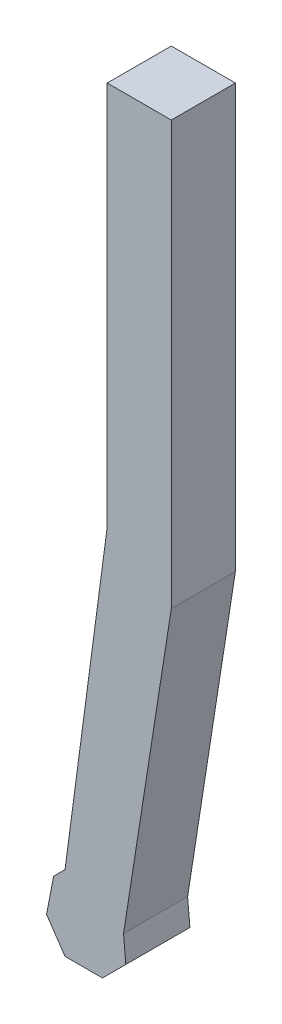
ISO-10303-21;
HEADER;
FILE_DESCRIPTION(('STEP AP214'),'2;1');
FILE_NAME('part.step','',(''),(''),'','','');
FILE_SCHEMA(('AUTOMOTIVE_DESIGN { 1 0 10303 214 1 1 1 1 }'));
ENDSEC;
DATA;
#1=APPLICATION_CONTEXT('core data for automotive mechanical design processes');
#2=APPLICATION_PROTOCOL_DEFINITION('international standard','automotive_design',2000,#1);
#3=PRODUCT_CONTEXT('',#1,'mechanical');
#4=PRODUCT('Part','Part','',(#3));
#5=PRODUCT_RELATED_PRODUCT_CATEGORY('part','',(#4));
#6=PRODUCT_DEFINITION_FORMATION('','',#4);
#7=PRODUCT_DEFINITION_CONTEXT('part definition',#1,'design');
#8=PRODUCT_DEFINITION('design','',#6,#7);
#9=PRODUCT_DEFINITION_SHAPE('','',#8);
#10=(LENGTH_UNIT() NAMED_UNIT(*) SI_UNIT(.MILLI.,.METRE.));
#11=(NAMED_UNIT(*) PLANE_ANGLE_UNIT() SI_UNIT($,.RADIAN.));
#12=(NAMED_UNIT(*) SI_UNIT($,.STERADIAN.) SOLID_ANGLE_UNIT());
#13=UNCERTAINTY_MEASURE_WITH_UNIT(LENGTH_MEASURE(1.E-05),#10,'distance_accuracy_value','');
#14=(GEOMETRIC_REPRESENTATION_CONTEXT(3) GLOBAL_UNCERTAINTY_ASSIGNED_CONTEXT((#13)) GLOBAL_UNIT_ASSIGNED_CONTEXT((#10,
#11,#12)) REPRESENTATION_CONTEXT('',''));
#15=CARTESIAN_POINT('',(0.,0.,0.));
#16=DIRECTION('',(0.,0.,1.));
#17=DIRECTION('',(1.,0.,0.));
#18=AXIS2_PLACEMENT_3D('',#15,#16,#17);
#19=CARTESIAN_POINT('',(10.9658885094651,-10.9658885094649,5.));
#20=DIRECTION('',(-0.707106781186554,0.707106781186541,0.));
#21=DIRECTION('',(-0.707106781186541,-0.707106781186554,0.));
#22=AXIS2_PLACEMENT_3D('',#19,#20,#21);
#23=PLANE('',#22);
#24=DIRECTION('',(0.707106781186541,0.707106781186554,0.));
#25=VECTOR('',#24,1.);
#26=CARTESIAN_POINT('',(10.9658885094651,-10.9658885094649,0.));
#27=LINE('',#26,#25);
#28=CARTESIAN_POINT('',(0.712067707518721,-21.2197093114115,0.));
#29=VERTEX_POINT('',#28);
#30=CARTESIAN_POINT('',(2.53558057867476,-19.3961964402554,0.));
#31=VERTEX_POINT('',#30);
#32=EDGE_CURVE('E155',#29,#31,#27,.T.);
#33=ORIENTED_EDGE('',*,*,#32,.T.);
#34=DIRECTION('',(0.,0.,-1.));
#35=VECTOR('',#34,1.);
#36=CARTESIAN_POINT('',(2.53558057867476,-19.3961964402554,5.));
#37=LINE('',#36,#35);
#38=CARTESIAN_POINT('',(2.53558057867476,-19.3961964402554,5.));
#39=VERTEX_POINT('',#38);
#40=EDGE_CURVE('E11',#39,#31,#37,.T.);
#41=ORIENTED_EDGE('',*,*,#40,.F.);
#42=DIRECTION('',(0.707106781186541,0.707106781186554,0.));
#43=VECTOR('',#42,1.);
#44=CARTESIAN_POINT('',(10.9658885094651,-10.9658885094649,5.));
#45=LINE('',#44,#43);
#46=CARTESIAN_POINT('',(0.712067707518721,-21.2197093114115,5.));
#47=VERTEX_POINT('',#46);
#48=EDGE_CURVE('E179',#47,#39,#45,.T.);
#49=ORIENTED_EDGE('',*,*,#48,.F.);
#50=DIRECTION('',(0.,0.,-1.));
#51=VECTOR('',#50,1.);
#52=CARTESIAN_POINT('',(0.712067707518721,-21.2197093114115,5.));
#53=LINE('',#52,#51);
#54=EDGE_CURVE('E151',#47,#29,#53,.T.);
#55=ORIENTED_EDGE('',*,*,#54,.T.);
#56=EDGE_LOOP('',(#33,#41,#49,#55));
#57=FACE_BOUND('',#56,.T.);
#58=ADVANCED_FACE('F41',(#57),#23,.F.);
#59=CARTESIAN_POINT('',(0.800509947770934,0.0713465126791633,5.));
#60=DIRECTION('',(-0.996051755430846,-0.088774436090187,0.));
#61=DIRECTION('',(0.088774436090187,-0.996051755430846,0.));
#62=AXIS2_PLACEMENT_3D('',#59,#60,#61);
#63=PLANE('',#62);
#64=DIRECTION('',(-0.088774436090187,0.996051755430846,0.));
#65=VECTOR('',#64,1.);
#66=CARTESIAN_POINT('',(0.800509947770934,0.0713465126791633,0.));
#67=LINE('',#66,#65);
#68=CARTESIAN_POINT('',(2.35780038750416,-17.4014975235942,0.));
#69=VERTEX_POINT('',#68);
#70=EDGE_CURVE('E158',#31,#69,#67,.T.);
#71=ORIENTED_EDGE('',*,*,#70,.T.);
#72=DIRECTION('',(0.,0.,-1.));
#73=VECTOR('',#72,1.);
#74=CARTESIAN_POINT('',(2.35780038750416,-17.4014975235942,5.));
#75=LINE('',#74,#73);
#76=CARTESIAN_POINT('',(2.35780038750416,-17.4014975235942,5.));
#77=VERTEX_POINT('',#76);
#78=EDGE_CURVE('E49',#77,#69,#75,.T.);
#79=ORIENTED_EDGE('',*,*,#78,.F.);
#80=DIRECTION('',(-0.088774436090187,0.996051755430846,0.));
#81=VECTOR('',#80,1.);
#82=CARTESIAN_POINT('',(0.800509947770934,0.0713465126791633,5.));
#83=LINE('',#82,#81);
#84=EDGE_CURVE('E109',#39,#77,#83,.T.);
#85=ORIENTED_EDGE('',*,*,#84,.F.);
#86=ORIENTED_EDGE('',*,*,#40,.T.);
#87=EDGE_LOOP('',(#71,#79,#85,#86));
#88=FACE_BOUND('',#87,.T.);
#89=ADVANCED_FACE('F200',(#88),#63,.F.);
#90=CARTESIAN_POINT('',(4.95814080161372,-0.775461693770349,5.));
#91=DIRECTION('',(0.987989161275998,-0.154523193084891,0.));
#92=DIRECTION('',(0.154523193084891,0.987989161275998,0.));
#93=AXIS2_PLACEMENT_3D('',#90,#91,#92);
#94=PLANE('',#93);
#95=DIRECTION('',(-0.154523193084891,-0.987989161275998,0.));
#96=VECTOR('',#95,1.);
#97=CARTESIAN_POINT('',(4.95814080161372,-0.775461693770349,0.));
#98=LINE('',#97,#96);
#99=CARTESIAN_POINT('',(6.08450000651986,6.42624481988781,0.));
#100=VERTEX_POINT('',#99);
#101=EDGE_CURVE('E161',#100,#69,#98,.T.);
#102=ORIENTED_EDGE('',*,*,#101,.F.);
#103=DIRECTION('',(0.,0.,-1.));
#104=VECTOR('',#103,1.);
#105=CARTESIAN_POINT('',(6.08450000651986,6.42624481988781,5.));
#106=LINE('',#105,#104);
#107=CARTESIAN_POINT('',(6.08450000651986,6.42624481988781,5.));
#108=VERTEX_POINT('',#107);
#109=EDGE_CURVE('E193',#108,#100,#106,.T.);
#110=ORIENTED_EDGE('',*,*,#109,.F.);
#111=DIRECTION('',(-0.154523193084891,-0.987989161275998,0.));
#112=VECTOR('',#111,1.);
#113=CARTESIAN_POINT('',(4.95814080161372,-0.775461693770349,5.));
#114=LINE('',#113,#112);
#115=EDGE_CURVE('E199',#108,#77,#114,.T.);
#116=ORIENTED_EDGE('',*,*,#115,.T.);
#117=ORIENTED_EDGE('',*,*,#78,.T.);
#118=EDGE_LOOP('',(#102,#110,#116,#117));
#119=FACE_BOUND('',#118,.T.);
#120=ADVANCED_FACE('F197',(#119),#94,.T.);
#121=CARTESIAN_POINT('',(6.08450000651986,0.,5.));
#122=DIRECTION('',(1.,0.,0.));
#123=DIRECTION('',(0.,1.,0.));
#124=AXIS2_PLACEMENT_3D('',#121,#122,#123);
#125=PLANE('',#124);
#126=DIRECTION('',(0.,-1.,0.));
#127=VECTOR('',#126,1.);
#128=CARTESIAN_POINT('',(6.08450000651986,0.,0.));
#129=LINE('',#128,#127);
#130=CARTESIAN_POINT('',(6.08450000651986,39.4262448198878,0.));
#131=VERTEX_POINT('',#130);
#132=EDGE_CURVE('E164',#131,#100,#129,.T.);
#133=ORIENTED_EDGE('',*,*,#132,.F.);
#134=DIRECTION('',(0.,0.,-1.));
#135=VECTOR('',#134,1.);
#136=CARTESIAN_POINT('',(6.08450000651986,39.4262448198878,5.));
#137=LINE('',#136,#135);
#138=CARTESIAN_POINT('',(6.08450000651986,39.4262448198878,5.));
#139=VERTEX_POINT('',#138);
#140=EDGE_CURVE('E191',#139,#131,#137,.T.);
#141=ORIENTED_EDGE('',*,*,#140,.F.);
#142=DIRECTION('',(0.,-1.,0.));
#143=VECTOR('',#142,1.);
#144=CARTESIAN_POINT('',(6.08450000651986,0.,5.));
#145=LINE('',#144,#143);
#146=EDGE_CURVE('E212',#139,#108,#145,.T.);
#147=ORIENTED_EDGE('',*,*,#146,.T.);
#148=ORIENTED_EDGE('',*,*,#109,.T.);
#149=EDGE_LOOP('',(#133,#141,#147,#148));
#150=FACE_BOUND('',#149,.T.);
#151=ADVANCED_FACE('F209',(#150),#125,.T.);
#152=CARTESIAN_POINT('',(0.,39.4262448198878,5.));
#153=DIRECTION('',(0.,1.,0.));
#154=DIRECTION('',(0.,0.,1.));
#155=AXIS2_PLACEMENT_3D('',#152,#153,#154);
#156=PLANE('',#155);
#157=DIRECTION('',(1.,0.,0.));
#158=VECTOR('',#157,1.);
#159=CARTESIAN_POINT('',(0.,39.4262448198878,0.));
#160=LINE('',#159,#158);
#161=CARTESIAN_POINT('',(1.08450000651986,39.4262448198878,0.));
#162=VERTEX_POINT('',#161);
#163=EDGE_CURVE('E167',#162,#131,#160,.T.);
#164=ORIENTED_EDGE('',*,*,#163,.F.);
#165=DIRECTION('',(0.,0.,-1.));
#166=VECTOR('',#165,1.);
#167=CARTESIAN_POINT('',(1.08450000651986,39.4262448198878,5.));
#168=LINE('',#167,#166);
#169=CARTESIAN_POINT('',(1.08450000651986,39.4262448198878,5.));
#170=VERTEX_POINT('',#169);
#171=EDGE_CURVE('E189',#170,#162,#168,.T.);
#172=ORIENTED_EDGE('',*,*,#171,.F.);
#173=DIRECTION('',(1.,0.,0.));
#174=VECTOR('',#173,1.);
#175=CARTESIAN_POINT('',(0.,39.4262448198878,5.));
#176=LINE('',#175,#174);
#177=EDGE_CURVE('E216',#170,#139,#176,.T.);
#178=ORIENTED_EDGE('',*,*,#177,.T.);
#179=ORIENTED_EDGE('',*,*,#140,.T.);
#180=EDGE_LOOP('',(#164,#172,#178,#179));
#181=FACE_BOUND('',#180,.T.);
#182=ADVANCED_FACE('F258',(#181),#156,.T.);
#183=CARTESIAN_POINT('',(1.08450000651986,0.,5.));
#184=DIRECTION('',(1.,0.,0.));
#185=DIRECTION('',(0.,1.,0.));
#186=AXIS2_PLACEMENT_3D('',#183,#184,#185);
#187=PLANE('',#186);
#188=DIRECTION('',(0.,-1.,0.));
#189=VECTOR('',#188,1.);
#190=CARTESIAN_POINT('',(1.08450000651986,0.,0.));
#191=LINE('',#190,#189);
#192=CARTESIAN_POINT('',(1.08450000651986,9.42624481988781,0.));
#193=VERTEX_POINT('',#192);
#194=EDGE_CURVE('E170',#162,#193,#191,.T.);
#195=ORIENTED_EDGE('',*,*,#194,.T.);
#196=DIRECTION('',(0.,0.,-1.));
#197=VECTOR('',#196,1.);
#198=CARTESIAN_POINT('',(1.08450000651986,9.42624481988781,5.));
#199=LINE('',#198,#197);
#200=CARTESIAN_POINT('',(1.08450000651986,9.42624481988781,5.));
#201=VERTEX_POINT('',#200);
#202=EDGE_CURVE('E186',#201,#193,#199,.T.);
#203=ORIENTED_EDGE('',*,*,#202,.F.);
#204=DIRECTION('',(0.,-1.,0.));
#205=VECTOR('',#204,1.);
#206=CARTESIAN_POINT('',(1.08450000651986,0.,5.));
#207=LINE('',#206,#205);
#208=EDGE_CURVE('E222',#170,#201,#207,.T.);
#209=ORIENTED_EDGE('',*,*,#208,.F.);
#210=ORIENTED_EDGE('',*,*,#171,.T.);
#211=EDGE_LOOP('',(#195,#203,#209,#210));
#212=FACE_BOUND('',#211,.T.);
#213=ADVANCED_FACE('F261',(#212),#187,.F.);
#214=CARTESIAN_POINT('',(-0.163735312612638,0.0217321414922228,5.));
#215=DIRECTION('',(0.991306431261412,-0.131573399058332,0.));
#216=DIRECTION('',(0.131573399058332,0.991306431261412,0.));
#217=AXIS2_PLACEMENT_3D('',#214,#215,#216);
#218=PLANE('',#217);
#219=DIRECTION('',(-0.131573399058332,-0.991306431261412,0.));
#220=VECTOR('',#219,1.);
#221=CARTESIAN_POINT('',(-0.163735312612638,0.0217321414922228,0.));
#222=LINE('',#221,#220);
#223=CARTESIAN_POINT('',(-2.20483496993844,-15.3564159616475,0.));
#224=VERTEX_POINT('',#223);
#225=EDGE_CURVE('E172',#193,#224,#222,.T.);
#226=ORIENTED_EDGE('',*,*,#225,.T.);
#227=DIRECTION('',(0.,0.,-1.));
#228=VECTOR('',#227,1.);
#229=CARTESIAN_POINT('',(-2.20483496993844,-15.3564159616475,5.));
#230=LINE('',#229,#228);
#231=CARTESIAN_POINT('',(-2.20483496993844,-15.3564159616475,5.));
#232=VERTEX_POINT('',#231);
#233=EDGE_CURVE('E183',#232,#224,#230,.T.);
#234=ORIENTED_EDGE('',*,*,#233,.F.);
#235=DIRECTION('',(-0.131573399058332,-0.991306431261412,0.));
#236=VECTOR('',#235,1.);
#237=CARTESIAN_POINT('',(-0.163735312612638,0.0217321414922228,5.));
#238=LINE('',#237,#236);
#239=EDGE_CURVE('E224',#201,#232,#238,.T.);
#240=ORIENTED_EDGE('',*,*,#239,.F.);
#241=ORIENTED_EDGE('',*,*,#202,.T.);
#242=EDGE_LOOP('',(#226,#234,#240,#241));
#243=FACE_BOUND('',#242,.T.);
#244=ADVANCED_FACE('F230',(#243),#218,.F.);
#245=CARTESIAN_POINT('',(6.5757904958545,-6.57579049585438,5.));
#246=DIRECTION('',(0.707106781186554,-0.707106781186541,0.));
#247=DIRECTION('',(0.707106781186541,0.707106781186554,0.));
#248=AXIS2_PLACEMENT_3D('',#245,#246,#247);
#249=PLANE('',#248);
#250=DIRECTION('',(-0.707106781186541,-0.707106781186554,0.));
#251=VECTOR('',#250,1.);
#252=CARTESIAN_POINT('',(6.5757904958545,-6.57579049585438,0.));
#253=LINE('',#252,#251);
#254=CARTESIAN_POINT('',(-3.09647287598627,-16.2480538676953,0.));
#255=VERTEX_POINT('',#254);
#256=EDGE_CURVE('E174',#224,#255,#253,.T.);
#257=ORIENTED_EDGE('',*,*,#256,.T.);
#258=DIRECTION('',(0.,0.,-1.));
#259=VECTOR('',#258,1.);
#260=CARTESIAN_POINT('',(-3.09647287598627,-16.2480538676953,5.));
#261=LINE('',#260,#259);
#262=CARTESIAN_POINT('',(-3.09647287598627,-16.2480538676953,5.));
#263=VERTEX_POINT('',#262);
#264=EDGE_CURVE('E146',#263,#255,#261,.T.);
#265=ORIENTED_EDGE('',*,*,#264,.F.);
#266=DIRECTION('',(-0.707106781186541,-0.707106781186554,0.));
#267=VECTOR('',#266,1.);
#268=CARTESIAN_POINT('',(6.5757904958545,-6.57579049585438,5.));
#269=LINE('',#268,#267);
#270=EDGE_CURVE('E137',#232,#263,#269,.T.);
#271=ORIENTED_EDGE('',*,*,#270,.F.);
#272=ORIENTED_EDGE('',*,*,#233,.T.);
#273=EDGE_LOOP('',(#257,#265,#271,#272));
#274=FACE_BOUND('',#273,.T.);
#275=ADVANCED_FACE('F234',(#274),#249,.F.);
#276=CARTESIAN_POINT('',(0.00993952606121932,-0.00190052785919091,5.));
#277=DIRECTION('',(0.982206003201185,-0.187806728515123,0.));
#278=DIRECTION('',(0.187806728515123,0.982206003201185,0.));
#279=AXIS2_PLACEMENT_3D('',#276,#277,#278);
#280=PLANE('',#279);
#281=DIRECTION('',(-0.187806728515123,-0.982206003201185,0.));
#282=VECTOR('',#281,1.);
#283=CARTESIAN_POINT('',(0.00993952606121932,-0.00190052785919091,0.));
#284=LINE('',#283,#282);
#285=CARTESIAN_POINT('',(-3.64228651433827,-19.1025918092113,0.));
#286=VERTEX_POINT('',#285);
#287=EDGE_CURVE('E145',#255,#286,#284,.T.);
#288=ORIENTED_EDGE('',*,*,#287,.T.);
#289=DIRECTION('',(0.,0.,-1.));
#290=VECTOR('',#289,1.);
#291=CARTESIAN_POINT('',(-3.64228651433827,-19.1025918092113,5.));
#292=LINE('',#291,#290);
#293=CARTESIAN_POINT('',(-3.64228651433827,-19.1025918092113,5.));
#294=VERTEX_POINT('',#293);
#295=EDGE_CURVE('E142',#294,#286,#292,.T.);
#296=ORIENTED_EDGE('',*,*,#295,.F.);
#297=DIRECTION('',(-0.187806728515123,-0.982206003201185,0.));
#298=VECTOR('',#297,1.);
#299=CARTESIAN_POINT('',(0.00993952606121932,-0.00190052785919091,5.));
#300=LINE('',#299,#298);
#301=EDGE_CURVE('E131',#263,#294,#300,.T.);
#302=ORIENTED_EDGE('',*,*,#301,.F.);
#303=ORIENTED_EDGE('',*,*,#264,.T.);
#304=EDGE_LOOP('',(#288,#296,#302,#303));
#305=FACE_BOUND('',#304,.T.);
#306=ADVANCED_FACE('F143',(#305),#280,.F.);
#307=CARTESIAN_POINT('',(-11.3705386339157,-7.7202131213756,5.));
#308=DIRECTION('',(0.82732393667119,0.561725114100202,0.));
#309=DIRECTION('',(-0.561725114100202,0.82732393667119,0.));
#310=AXIS2_PLACEMENT_3D('',#307,#308,#309);
#311=PLANE('',#310);
#312=DIRECTION('',(0.561725114100202,-0.82732393667119,0.));
#313=VECTOR('',#312,1.);
#314=CARTESIAN_POINT('',(-11.3705386339157,-7.7202131213756,0.));
#315=LINE('',#314,#313);
#316=CARTESIAN_POINT('',(-2.20483496993844,-21.2197093114115,0.));
#317=VERTEX_POINT('',#316);
#318=EDGE_CURVE('E95',#286,#317,#315,.T.);
#319=ORIENTED_EDGE('',*,*,#318,.T.);
#320=DIRECTION('',(0.,0.,-1.));
#321=VECTOR('',#320,1.);
#322=CARTESIAN_POINT('',(-2.20483496993844,-21.2197093114115,5.));
#323=LINE('',#322,#321);
#324=CARTESIAN_POINT('',(-2.20483496993844,-21.2197093114115,5.));
#325=VERTEX_POINT('',#324);
#326=EDGE_CURVE('E147',#325,#317,#323,.T.);
#327=ORIENTED_EDGE('',*,*,#326,.F.);
#328=DIRECTION('',(0.561725114100202,-0.82732393667119,0.));
#329=VECTOR('',#328,1.);
#330=CARTESIAN_POINT('',(-11.3705386339157,-7.7202131213756,5.));
#331=LINE('',#330,#329);
#332=EDGE_CURVE('E135',#294,#325,#331,.T.);
#333=ORIENTED_EDGE('',*,*,#332,.F.);
#334=ORIENTED_EDGE('',*,*,#295,.T.);
#335=EDGE_LOOP('',(#319,#327,#333,#334));
#336=FACE_BOUND('',#335,.T.);
#337=ADVANCED_FACE('F149',(#336),#311,.F.);
#338=CARTESIAN_POINT('',(0.,-21.2197093114115,5.));
#339=DIRECTION('',(0.,1.,0.));
#340=DIRECTION('',(0.,0.,1.));
#341=AXIS2_PLACEMENT_3D('',#338,#339,#340);
#342=PLANE('',#341);
#343=DIRECTION('',(1.,0.,0.));
#344=VECTOR('',#343,1.);
#345=CARTESIAN_POINT('',(0.,-21.2197093114115,0.));
#346=LINE('',#345,#344);
#347=EDGE_CURVE('E101',#317,#29,#346,.T.);
#348=ORIENTED_EDGE('',*,*,#347,.T.);
#349=ORIENTED_EDGE('',*,*,#54,.F.);
#350=DIRECTION('',(1.,0.,0.));
#351=VECTOR('',#350,1.);
#352=CARTESIAN_POINT('',(0.,-21.2197093114115,5.));
#353=LINE('',#352,#351);
#354=EDGE_CURVE('E57',#325,#47,#353,.T.);
#355=ORIENTED_EDGE('',*,*,#354,.F.);
#356=ORIENTED_EDGE('',*,*,#326,.T.);
#357=EDGE_LOOP('',(#348,#349,#355,#356));
#358=FACE_BOUND('',#357,.T.);
#359=ADVANCED_FACE('F237',(#358),#342,.F.);
#360=CARTESIAN_POINT('',(0.,0.,5.));
#361=DIRECTION('',(0.,0.,1.));
#362=DIRECTION('',(1.,0.,0.));
#363=AXIS2_PLACEMENT_3D('',#360,#361,#362);
#364=PLANE('',#363);
#365=ORIENTED_EDGE('',*,*,#48,.T.);
#366=ORIENTED_EDGE('',*,*,#84,.T.);
#367=ORIENTED_EDGE('',*,*,#115,.F.);
#368=ORIENTED_EDGE('',*,*,#146,.F.);
#369=ORIENTED_EDGE('',*,*,#177,.F.);
#370=ORIENTED_EDGE('',*,*,#208,.T.);
#371=ORIENTED_EDGE('',*,*,#239,.T.);
#372=ORIENTED_EDGE('',*,*,#270,.T.);
#373=ORIENTED_EDGE('',*,*,#301,.T.);
#374=ORIENTED_EDGE('',*,*,#332,.T.);
#375=ORIENTED_EDGE('',*,*,#354,.T.);
#376=EDGE_LOOP('',(#365,#366,#367,#368,#369,#370,#371,#372,#373,#374,#375));
#377=FACE_BOUND('',#376,.T.);
#378=ADVANCED_FACE('F133',(#377),#364,.T.);
#379=CARTESIAN_POINT('',(0.,0.,0.));
#380=DIRECTION('',(0.,0.,1.));
#381=DIRECTION('',(1.,0.,0.));
#382=AXIS2_PLACEMENT_3D('',#379,#380,#381);
#383=PLANE('',#382);
#384=ORIENTED_EDGE('',*,*,#32,.F.);
#385=ORIENTED_EDGE('',*,*,#347,.F.);
#386=ORIENTED_EDGE('',*,*,#318,.F.);
#387=ORIENTED_EDGE('',*,*,#287,.F.);
#388=ORIENTED_EDGE('',*,*,#256,.F.);
#389=ORIENTED_EDGE('',*,*,#225,.F.);
#390=ORIENTED_EDGE('',*,*,#194,.F.);
#391=ORIENTED_EDGE('',*,*,#163,.T.);
#392=ORIENTED_EDGE('',*,*,#132,.T.);
#393=ORIENTED_EDGE('',*,*,#101,.T.);
#394=ORIENTED_EDGE('',*,*,#70,.F.);
#395=EDGE_LOOP('',(#384,#385,#386,#387,#388,#389,#390,#391,#392,#393,#394));
#396=FACE_BOUND('',#395,.T.);
#397=ADVANCED_FACE('F204',(#396),#383,.F.);
#398=CLOSED_SHELL('',(#58,#89,#120,#151,#182,#213,#244,#275,#306,#337,#359,#378,#397));
#399=MANIFOLD_SOLID_BREP('B2',#398);
#400=ADVANCED_BREP_SHAPE_REPRESENTATION('',(#18,#399),#14);
#401=SHAPE_DEFINITION_REPRESENTATION(#9,#400);
ENDSEC;
END-ISO-10303-21;
